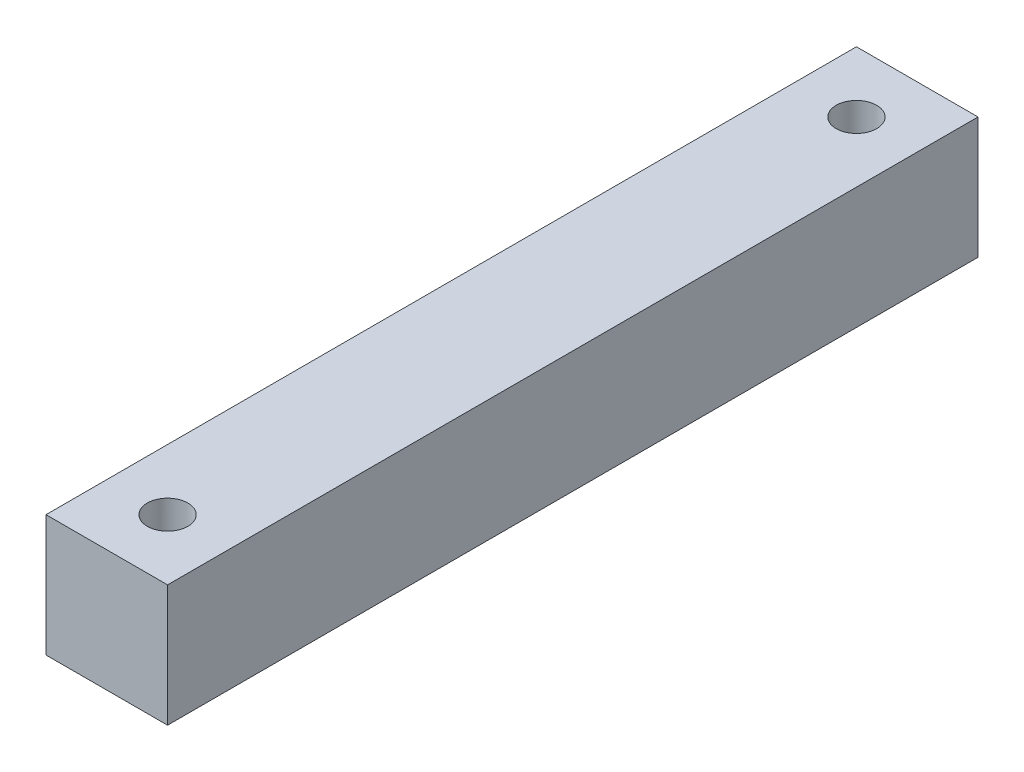
ISO-10303-21;
HEADER;
FILE_DESCRIPTION(('STEP AP214'),'2;1');
FILE_NAME('part.step','',(''),(''),'','','');
FILE_SCHEMA(('AUTOMOTIVE_DESIGN { 1 0 10303 214 1 1 1 1 }'));
ENDSEC;
DATA;
#1=APPLICATION_CONTEXT('core data for automotive mechanical design processes');
#2=APPLICATION_PROTOCOL_DEFINITION('international standard','automotive_design',2000,#1);
#3=PRODUCT_CONTEXT('',#1,'mechanical');
#4=PRODUCT('Part','Part','',(#3));
#5=PRODUCT_RELATED_PRODUCT_CATEGORY('part','',(#4));
#6=PRODUCT_DEFINITION_FORMATION('','',#4);
#7=PRODUCT_DEFINITION_CONTEXT('part definition',#1,'design');
#8=PRODUCT_DEFINITION('design','',#6,#7);
#9=PRODUCT_DEFINITION_SHAPE('','',#8);
#10=(LENGTH_UNIT() NAMED_UNIT(*) SI_UNIT(.MILLI.,.METRE.));
#11=(NAMED_UNIT(*) PLANE_ANGLE_UNIT() SI_UNIT($,.RADIAN.));
#12=(NAMED_UNIT(*) SI_UNIT($,.STERADIAN.) SOLID_ANGLE_UNIT());
#13=UNCERTAINTY_MEASURE_WITH_UNIT(LENGTH_MEASURE(1.E-05),#10,'distance_accuracy_value','');
#14=(GEOMETRIC_REPRESENTATION_CONTEXT(3) GLOBAL_UNCERTAINTY_ASSIGNED_CONTEXT((#13)) GLOBAL_UNIT_ASSIGNED_CONTEXT((#10,
#11,#12)) REPRESENTATION_CONTEXT('',''));
#15=CARTESIAN_POINT('',(0.,0.,0.));
#16=DIRECTION('',(0.,0.,1.));
#17=DIRECTION('',(1.,0.,0.));
#18=AXIS2_PLACEMENT_3D('',#15,#16,#17);
#19=CARTESIAN_POINT('',(30.,-30.,400.));
#20=DIRECTION('',(-1.,0.,0.));
#21=DIRECTION('',(0.,0.,1.));
#22=AXIS2_PLACEMENT_3D('',#19,#20,#21);
#23=PLANE('',#22);
#24=DIRECTION('',(0.,1.,0.));
#25=VECTOR('',#24,1.);
#26=CARTESIAN_POINT('',(30.,-30.,0.));
#27=LINE('',#26,#25);
#28=CARTESIAN_POINT('',(30.,-30.,0.));
#29=VERTEX_POINT('',#28);
#30=CARTESIAN_POINT('',(30.,30.,0.));
#31=VERTEX_POINT('',#30);
#32=EDGE_CURVE('E130',#29,#31,#27,.T.);
#33=ORIENTED_EDGE('',*,*,#32,.T.);
#34=DIRECTION('',(0.,0.,-1.));
#35=VECTOR('',#34,1.);
#36=CARTESIAN_POINT('',(30.,30.,400.));
#37=LINE('',#36,#35);
#38=CARTESIAN_POINT('',(30.,30.,400.));
#39=VERTEX_POINT('',#38);
#40=EDGE_CURVE('E104',#39,#31,#37,.T.);
#41=ORIENTED_EDGE('',*,*,#40,.F.);
#42=DIRECTION('',(0.,1.,0.));
#43=VECTOR('',#42,1.);
#44=CARTESIAN_POINT('',(30.,-30.,400.));
#45=LINE('',#44,#43);
#46=CARTESIAN_POINT('',(30.,-30.,400.));
#47=VERTEX_POINT('',#46);
#48=EDGE_CURVE('E125',#47,#39,#45,.T.);
#49=ORIENTED_EDGE('',*,*,#48,.F.);
#50=DIRECTION('',(0.,0.,-1.));
#51=VECTOR('',#50,1.);
#52=CARTESIAN_POINT('',(30.,-30.,400.));
#53=LINE('',#52,#51);
#54=EDGE_CURVE('E120',#47,#29,#53,.T.);
#55=ORIENTED_EDGE('',*,*,#54,.T.);
#56=EDGE_LOOP('',(#33,#41,#49,#55));
#57=FACE_BOUND('',#56,.T.);
#58=ADVANCED_FACE('F39',(#57),#23,.F.);
#59=CARTESIAN_POINT('',(-30.,30.,400.));
#60=DIRECTION('',(0.,-1.,0.));
#61=DIRECTION('',(0.,0.,-1.));
#62=AXIS2_PLACEMENT_3D('',#59,#60,#61);
#63=PLANE('',#62);
#64=CARTESIAN_POINT('',(0.,30.,370.));
#65=DIRECTION('',(0.,-1.,0.));
#66=DIRECTION('',(0.,0.,-1.));
#67=AXIS2_PLACEMENT_3D('',#64,#65,#66);
#68=CIRCLE('',#67,10.);
#69=CARTESIAN_POINT('',(0.,30.,360.));
#70=VERTEX_POINT('',#69);
#71=EDGE_CURVE('E150',#70,#70,#68,.T.);
#72=ORIENTED_EDGE('',*,*,#71,.T.);
#73=EDGE_LOOP('',(#72));
#74=FACE_BOUND('',#73,.T.);
#75=CARTESIAN_POINT('',(0.,30.,30.));
#76=DIRECTION('',(0.,-1.,0.));
#77=DIRECTION('',(0.,0.,-1.));
#78=AXIS2_PLACEMENT_3D('',#75,#76,#77);
#79=CIRCLE('',#78,10.);
#80=CARTESIAN_POINT('',(0.,30.,20.));
#81=VERTEX_POINT('',#80);
#82=EDGE_CURVE('E139',#81,#81,#79,.T.);
#83=ORIENTED_EDGE('',*,*,#82,.T.);
#84=EDGE_LOOP('',(#83));
#85=FACE_BOUND('',#84,.T.);
#86=DIRECTION('',(-1.,0.,0.));
#87=VECTOR('',#86,1.);
#88=CARTESIAN_POINT('',(-30.,30.,0.));
#89=LINE('',#88,#87);
#90=CARTESIAN_POINT('',(-30.,30.,0.));
#91=VERTEX_POINT('',#90);
#92=EDGE_CURVE('E122',#31,#91,#89,.T.);
#93=ORIENTED_EDGE('',*,*,#92,.T.);
#94=DIRECTION('',(0.,0.,-1.));
#95=VECTOR('',#94,1.);
#96=CARTESIAN_POINT('',(-30.,30.,400.));
#97=LINE('',#96,#95);
#98=CARTESIAN_POINT('',(-30.,30.,400.));
#99=VERTEX_POINT('',#98);
#100=EDGE_CURVE('E111',#99,#91,#97,.T.);
#101=ORIENTED_EDGE('',*,*,#100,.F.);
#102=DIRECTION('',(-1.,0.,0.));
#103=VECTOR('',#102,1.);
#104=CARTESIAN_POINT('',(-30.,30.,400.));
#105=LINE('',#104,#103);
#106=EDGE_CURVE('E93',#39,#99,#105,.T.);
#107=ORIENTED_EDGE('',*,*,#106,.F.);
#108=ORIENTED_EDGE('',*,*,#40,.T.);
#109=EDGE_LOOP('',(#93,#101,#107,#108));
#110=FACE_BOUND('',#109,.T.);
#111=ADVANCED_FACE('F166',(#74,#85,#110),#63,.F.);
#112=CARTESIAN_POINT('',(-30.,-30.,400.));
#113=DIRECTION('',(1.,0.,0.));
#114=DIRECTION('',(0.,0.,-1.));
#115=AXIS2_PLACEMENT_3D('',#112,#113,#114);
#116=PLANE('',#115);
#117=DIRECTION('',(0.,-1.,0.));
#118=VECTOR('',#117,1.);
#119=CARTESIAN_POINT('',(-30.,-30.,0.));
#120=LINE('',#119,#118);
#121=CARTESIAN_POINT('',(-30.,-30.,0.));
#122=VERTEX_POINT('',#121);
#123=EDGE_CURVE('E121',#91,#122,#120,.T.);
#124=ORIENTED_EDGE('',*,*,#123,.T.);
#125=DIRECTION('',(0.,0.,-1.));
#126=VECTOR('',#125,1.);
#127=CARTESIAN_POINT('',(-30.,-30.,400.));
#128=LINE('',#127,#126);
#129=CARTESIAN_POINT('',(-30.,-30.,400.));
#130=VERTEX_POINT('',#129);
#131=EDGE_CURVE('E119',#130,#122,#128,.T.);
#132=ORIENTED_EDGE('',*,*,#131,.F.);
#133=DIRECTION('',(0.,-1.,0.));
#134=VECTOR('',#133,1.);
#135=CARTESIAN_POINT('',(-30.,-30.,400.));
#136=LINE('',#135,#134);
#137=EDGE_CURVE('E134',#99,#130,#136,.T.);
#138=ORIENTED_EDGE('',*,*,#137,.F.);
#139=ORIENTED_EDGE('',*,*,#100,.T.);
#140=EDGE_LOOP('',(#124,#132,#138,#139));
#141=FACE_BOUND('',#140,.T.);
#142=ADVANCED_FACE('F171',(#141),#116,.F.);
#143=CARTESIAN_POINT('',(-30.,-30.,400.));
#144=DIRECTION('',(0.,1.,0.));
#145=DIRECTION('',(0.,0.,1.));
#146=AXIS2_PLACEMENT_3D('',#143,#144,#145);
#147=PLANE('',#146);
#148=CARTESIAN_POINT('',(0.,-30.,370.));
#149=DIRECTION('',(0.,1.,0.));
#150=DIRECTION('',(0.,0.,1.));
#151=AXIS2_PLACEMENT_3D('',#148,#149,#150);
#152=CIRCLE('',#151,10.);
#153=CARTESIAN_POINT('',(0.,-30.,380.));
#154=VERTEX_POINT('',#153);
#155=EDGE_CURVE('E45',#154,#154,#152,.T.);
#156=ORIENTED_EDGE('',*,*,#155,.T.);
#157=EDGE_LOOP('',(#156));
#158=FACE_BOUND('',#157,.T.);
#159=CARTESIAN_POINT('',(0.,-30.,30.));
#160=DIRECTION('',(0.,1.,0.));
#161=DIRECTION('',(0.,0.,1.));
#162=AXIS2_PLACEMENT_3D('',#159,#160,#161);
#163=CIRCLE('',#162,10.);
#164=CARTESIAN_POINT('',(0.,-30.,40.));
#165=VERTEX_POINT('',#164);
#166=EDGE_CURVE('E145',#165,#165,#163,.T.);
#167=ORIENTED_EDGE('',*,*,#166,.T.);
#168=EDGE_LOOP('',(#167));
#169=FACE_BOUND('',#168,.T.);
#170=DIRECTION('',(1.,0.,0.));
#171=VECTOR('',#170,1.);
#172=CARTESIAN_POINT('',(-30.,-30.,0.));
#173=LINE('',#172,#171);
#174=EDGE_CURVE('E81',#122,#29,#173,.T.);
#175=ORIENTED_EDGE('',*,*,#174,.T.);
#176=ORIENTED_EDGE('',*,*,#54,.F.);
#177=DIRECTION('',(1.,0.,0.));
#178=VECTOR('',#177,1.);
#179=CARTESIAN_POINT('',(-30.,-30.,400.));
#180=LINE('',#179,#178);
#181=EDGE_CURVE('E64',#130,#47,#180,.T.);
#182=ORIENTED_EDGE('',*,*,#181,.F.);
#183=ORIENTED_EDGE('',*,*,#131,.T.);
#184=EDGE_LOOP('',(#175,#176,#182,#183));
#185=FACE_BOUND('',#184,.T.);
#186=ADVANCED_FACE('F152',(#158,#169,#185),#147,.F.);
#187=CARTESIAN_POINT('',(0.,0.,400.));
#188=DIRECTION('',(0.,0.,-1.));
#189=DIRECTION('',(-1.,0.,0.));
#190=AXIS2_PLACEMENT_3D('',#187,#188,#189);
#191=PLANE('',#190);
#192=ORIENTED_EDGE('',*,*,#48,.T.);
#193=ORIENTED_EDGE('',*,*,#106,.T.);
#194=ORIENTED_EDGE('',*,*,#137,.T.);
#195=ORIENTED_EDGE('',*,*,#181,.T.);
#196=EDGE_LOOP('',(#192,#193,#194,#195));
#197=FACE_BOUND('',#196,.T.);
#198=ADVANCED_FACE('F183',(#197),#191,.F.);
#199=CARTESIAN_POINT('',(0.,0.,0.));
#200=DIRECTION('',(0.,0.,-1.));
#201=DIRECTION('',(-1.,0.,0.));
#202=AXIS2_PLACEMENT_3D('',#199,#200,#201);
#203=PLANE('',#202);
#204=CARTESIAN_POINT('',(0.,0.,0.));
#205=DIRECTION('',(0.,0.,1.));
#206=DIRECTION('',(1.,0.,0.));
#207=AXIS2_PLACEMENT_3D('',#204,#205,#206);
#208=CIRCLE('',#207,10.);
#209=CARTESIAN_POINT('',(10.,0.,0.));
#210=VERTEX_POINT('',#209);
#211=EDGE_CURVE('E138',#210,#210,#208,.T.);
#212=ORIENTED_EDGE('',*,*,#211,.T.);
#213=EDGE_LOOP('',(#212));
#214=FACE_BOUND('',#213,.T.);
#215=ORIENTED_EDGE('',*,*,#32,.F.);
#216=ORIENTED_EDGE('',*,*,#174,.F.);
#217=ORIENTED_EDGE('',*,*,#123,.F.);
#218=ORIENTED_EDGE('',*,*,#92,.F.);
#219=EDGE_LOOP('',(#215,#216,#217,#218));
#220=FACE_BOUND('',#219,.T.);
#221=ADVANCED_FACE('F177',(#214,#220),#203,.T.);
#222=CARTESIAN_POINT('',(0.,0.,50.));
#223=DIRECTION('',(0.,0.,-1.));
#224=DIRECTION('',(-1.,0.,0.));
#225=AXIS2_PLACEMENT_3D('',#222,#223,#224);
#226=CYLINDRICAL_SURFACE('',#225,10.);
#227=CARTESIAN_POINT('',(0.,0.,30.));
#228=DIRECTION('',(0.,0.707106781186547,-0.707106781186547));
#229=DIRECTION('',(0.,-0.707106781186547,-0.707106781186547));
#230=AXIS2_PLACEMENT_3D('',#227,#228,#229);
#231=ELLIPSE('',#230,14.142135623731,10.);
#232=CARTESIAN_POINT('',(10.,0.,30.));
#233=VERTEX_POINT('',#232);
#234=CARTESIAN_POINT('',(-10.,0.,30.));
#235=VERTEX_POINT('',#234);
#236=EDGE_CURVE('E50',#233,#235,#231,.T.);
#237=ORIENTED_EDGE('',*,*,#236,.F.);
#238=CARTESIAN_POINT('',(0.,0.,30.));
#239=DIRECTION('',(0.,-0.707106781186547,-0.707106781186547));
#240=DIRECTION('',(0.,0.707106781186547,-0.707106781186547));
#241=AXIS2_PLACEMENT_3D('',#238,#239,#240);
#242=ELLIPSE('',#241,14.142135623731,10.);
#243=EDGE_CURVE('E96',#235,#233,#242,.T.);
#244=ORIENTED_EDGE('',*,*,#243,.F.);
#245=EDGE_LOOP('',(#237,#244));
#246=FACE_BOUND('',#245,.T.);
#247=ORIENTED_EDGE('',*,*,#211,.F.);
#248=EDGE_LOOP('',(#247));
#249=FACE_BOUND('',#248,.T.);
#250=ADVANCED_FACE('F108',(#246,#249),#226,.F.);
#251=CARTESIAN_POINT('',(0.,-60.,30.));
#252=DIRECTION('',(0.,1.,0.));
#253=DIRECTION('',(0.,0.,1.));
#254=AXIS2_PLACEMENT_3D('',#251,#252,#253);
#255=CYLINDRICAL_SURFACE('',#254,10.);
#256=ORIENTED_EDGE('',*,*,#236,.T.);
#257=CARTESIAN_POINT('',(0.,0.,30.));
#258=DIRECTION('',(0.,-0.707106781186547,-0.707106781186547));
#259=DIRECTION('',(0.,0.707106781186547,-0.707106781186547));
#260=AXIS2_PLACEMENT_3D('',#257,#258,#259);
#261=ELLIPSE('',#260,14.142135623731,10.);
#262=EDGE_CURVE('E52',#235,#233,#261,.F.);
#263=ORIENTED_EDGE('',*,*,#262,.T.);
#264=EDGE_LOOP('',(#256,#263));
#265=FACE_BOUND('',#264,.T.);
#266=ORIENTED_EDGE('',*,*,#166,.F.);
#267=EDGE_LOOP('',(#266));
#268=FACE_BOUND('',#267,.T.);
#269=ADVANCED_FACE('F103',(#265,#268),#255,.F.);
#270=CARTESIAN_POINT('',(0.,0.,30.));
#271=DIRECTION('',(0.,0.707106781186547,-0.707106781186547));
#272=DIRECTION('',(0.,-0.707106781186547,-0.707106781186547));
#273=AXIS2_PLACEMENT_3D('',#270,#271,#272);
#274=ELLIPSE('',#273,14.142135623731,10.);
#275=EDGE_CURVE('E11',#233,#235,#274,.F.);
#276=ORIENTED_EDGE('',*,*,#275,.T.);
#277=ORIENTED_EDGE('',*,*,#243,.T.);
#278=EDGE_LOOP('',(#276,#277));
#279=FACE_BOUND('',#278,.T.);
#280=ORIENTED_EDGE('',*,*,#82,.F.);
#281=EDGE_LOOP('',(#280));
#282=FACE_BOUND('',#281,.T.);
#283=ADVANCED_FACE('F100',(#279,#282),#255,.F.);
#284=CARTESIAN_POINT('',(0.,0.,50.));
#285=DIRECTION('',(0.,0.,1.));
#286=DIRECTION('',(1.,0.,0.));
#287=AXIS2_PLACEMENT_3D('',#284,#285,#286);
#288=PLANE('',#287);
#289=CARTESIAN_POINT('',(0.,0.,50.));
#290=DIRECTION('',(0.,0.,1.));
#291=DIRECTION('',(1.,0.,0.));
#292=AXIS2_PLACEMENT_3D('',#289,#290,#291);
#293=CIRCLE('',#292,10.);
#294=CARTESIAN_POINT('',(10.,0.,50.));
#295=VERTEX_POINT('',#294);
#296=EDGE_CURVE('E128',#295,#295,#293,.T.);
#297=ORIENTED_EDGE('',*,*,#296,.F.);
#298=EDGE_LOOP('',(#297));
#299=FACE_BOUND('',#298,.T.);
#300=ADVANCED_FACE('F164',(#299),#288,.F.);
#301=ORIENTED_EDGE('',*,*,#275,.F.);
#302=ORIENTED_EDGE('',*,*,#262,.F.);
#303=EDGE_LOOP('',(#301,#302));
#304=FACE_BOUND('',#303,.T.);
#305=ORIENTED_EDGE('',*,*,#296,.T.);
#306=EDGE_LOOP('',(#305));
#307=FACE_BOUND('',#306,.T.);
#308=ADVANCED_FACE('F110',(#304,#307),#226,.F.);
#309=CARTESIAN_POINT('',(0.,-60.,370.));
#310=DIRECTION('',(0.,1.,0.));
#311=DIRECTION('',(0.,0.,1.));
#312=AXIS2_PLACEMENT_3D('',#309,#310,#311);
#313=CYLINDRICAL_SURFACE('',#312,10.);
#314=ORIENTED_EDGE('',*,*,#155,.F.);
#315=EDGE_LOOP('',(#314));
#316=FACE_BOUND('',#315,.T.);
#317=ORIENTED_EDGE('',*,*,#71,.F.);
#318=EDGE_LOOP('',(#317));
#319=FACE_BOUND('',#318,.T.);
#320=ADVANCED_FACE('F160',(#316,#319),#313,.F.);
#321=CLOSED_SHELL('',(#58,#111,#142,#186,#198,#221,#250,#269,#283,#300,#308,#320));
#322=MANIFOLD_SOLID_BREP('B2',#321);
#323=ADVANCED_BREP_SHAPE_REPRESENTATION('',(#18,#322),#14);
#324=SHAPE_DEFINITION_REPRESENTATION(#9,#323);
ENDSEC;
END-ISO-10303-21;
